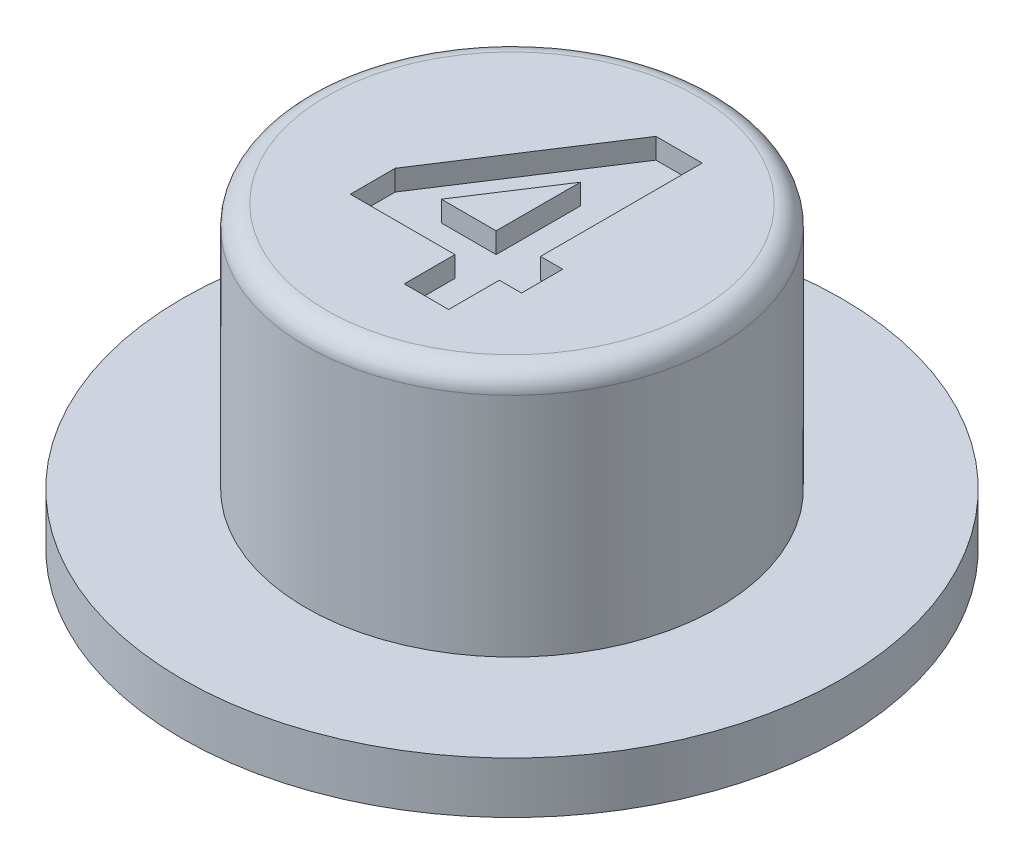
ISO-10303-21;
HEADER;
FILE_DESCRIPTION(('STEP AP214'),'2;1');
FILE_NAME('part.step','',(''),(''),'','','');
FILE_SCHEMA(('AUTOMOTIVE_DESIGN { 1 0 10303 214 1 1 1 1 }'));
ENDSEC;
DATA;
#1=APPLICATION_CONTEXT('core data for automotive mechanical design processes');
#2=APPLICATION_PROTOCOL_DEFINITION('international standard','automotive_design',2000,#1);
#3=PRODUCT_CONTEXT('',#1,'mechanical');
#4=PRODUCT('Part','Part','',(#3));
#5=PRODUCT_RELATED_PRODUCT_CATEGORY('part','',(#4));
#6=PRODUCT_DEFINITION_FORMATION('','',#4);
#7=PRODUCT_DEFINITION_CONTEXT('part definition',#1,'design');
#8=PRODUCT_DEFINITION('design','',#6,#7);
#9=PRODUCT_DEFINITION_SHAPE('','',#8);
#10=(LENGTH_UNIT() NAMED_UNIT(*) SI_UNIT(.MILLI.,.METRE.));
#11=(NAMED_UNIT(*) PLANE_ANGLE_UNIT() SI_UNIT($,.RADIAN.));
#12=(NAMED_UNIT(*) SI_UNIT($,.STERADIAN.) SOLID_ANGLE_UNIT());
#13=UNCERTAINTY_MEASURE_WITH_UNIT(LENGTH_MEASURE(1.E-05),#10,'distance_accuracy_value','');
#14=(GEOMETRIC_REPRESENTATION_CONTEXT(3) GLOBAL_UNCERTAINTY_ASSIGNED_CONTEXT((#13)) GLOBAL_UNIT_ASSIGNED_CONTEXT((#10,
#11,#12)) REPRESENTATION_CONTEXT('',''));
#15=CARTESIAN_POINT('',(0.,0.,0.));
#16=DIRECTION('',(0.,0.,1.));
#17=DIRECTION('',(1.,0.,0.));
#18=AXIS2_PLACEMENT_3D('',#15,#16,#17);
#19=CARTESIAN_POINT('',(0.,7.24999999999999,0.));
#20=DIRECTION('',(0.,-1.,0.));
#21=DIRECTION('',(1.,0.,0.));
#22=AXIS2_PLACEMENT_3D('',#19,#20,#21);
#23=PLANE('',#22);
#24=CARTESIAN_POINT('',(0.,7.24999999999999,0.));
#25=DIRECTION('',(0.,-1.,0.));
#26=DIRECTION('',(1.,0.,0.));
#27=AXIS2_PLACEMENT_3D('',#24,#25,#26);
#28=CIRCLE('',#27,4.49999999999999);
#29=CARTESIAN_POINT('',(4.49999999999999,7.25,0.));
#30=VERTEX_POINT('',#29);
#31=EDGE_CURVE('E41',#30,#30,#28,.F.);
#32=ORIENTED_EDGE('',*,*,#31,.T.);
#33=EDGE_LOOP('',(#32));
#34=FACE_BOUND('',#33,.T.);
#35=DIRECTION('',(0.545200849923092,0.,-0.838305453425622));
#36=VECTOR('',#35,1.);
#37=CARTESIAN_POINT('',(-2.15384615384617,7.24999999999999,0.679086538461539));
#38=LINE('',#37,#36);
#39=CARTESIAN_POINT('',(-2.15384615384617,7.24999999999999,0.679086538461539));
#40=VERTEX_POINT('',#39);
#41=CARTESIAN_POINT('',(0.338942307692288,7.24999999999999,-3.15384615384615));
#42=VERTEX_POINT('',#41);
#43=EDGE_CURVE('E48',#40,#42,#38,.T.);
#44=ORIENTED_EDGE('',*,*,#43,.T.);
#45=DIRECTION('',(1.,0.,0.));
#46=VECTOR('',#45,1.);
#47=CARTESIAN_POINT('',(0.338942307692288,7.24999999999999,-3.15384615384615));
#48=LINE('',#47,#46);
#49=CARTESIAN_POINT('',(1.46153846153844,7.25,-3.15384615384615));
#50=VERTEX_POINT('',#49);
#51=EDGE_CURVE('E218',#42,#50,#48,.T.);
#52=ORIENTED_EDGE('',*,*,#51,.T.);
#53=DIRECTION('',(0.,0.,1.));
#54=VECTOR('',#53,1.);
#55=CARTESIAN_POINT('',(1.46153846153844,7.25,-3.15384615384615));
#56=LINE('',#55,#54);
#57=CARTESIAN_POINT('',(1.46153846153844,7.25,0.769230769230769));
#58=VERTEX_POINT('',#57);
#59=EDGE_CURVE('E221',#50,#58,#56,.T.);
#60=ORIENTED_EDGE('',*,*,#59,.T.);
#61=DIRECTION('',(1.,0.,0.));
#62=VECTOR('',#61,1.);
#63=CARTESIAN_POINT('',(1.46153846153844,7.25,0.769230769230769));
#64=LINE('',#63,#62);
#65=CARTESIAN_POINT('',(1.99999999999998,7.25,0.769230769230769));
#66=VERTEX_POINT('',#65);
#67=EDGE_CURVE('E224',#58,#66,#64,.T.);
#68=ORIENTED_EDGE('',*,*,#67,.T.);
#69=DIRECTION('',(0.,0.,1.));
#70=VECTOR('',#69,1.);
#71=CARTESIAN_POINT('',(1.99999999999998,7.25,0.769230769230769));
#72=LINE('',#71,#70);
#73=CARTESIAN_POINT('',(1.99999999999998,7.25,1.76923076923077));
#74=VERTEX_POINT('',#73);
#75=EDGE_CURVE('E227',#66,#74,#72,.T.);
#76=ORIENTED_EDGE('',*,*,#75,.T.);
#77=DIRECTION('',(-1.,0.,0.));
#78=VECTOR('',#77,1.);
#79=CARTESIAN_POINT('',(1.99999999999998,7.25,1.76923076923077));
#80=LINE('',#79,#78);
#81=CARTESIAN_POINT('',(1.46153846153844,7.25,1.76923076923077));
#82=VERTEX_POINT('',#81);
#83=EDGE_CURVE('E230',#74,#82,#80,.T.);
#84=ORIENTED_EDGE('',*,*,#83,.T.);
#85=DIRECTION('',(0.,0.,1.));
#86=VECTOR('',#85,1.);
#87=CARTESIAN_POINT('',(1.46153846153844,7.25,1.76923076923077));
#88=LINE('',#87,#86);
#89=CARTESIAN_POINT('',(1.46153846153844,7.25,3.));
#90=VERTEX_POINT('',#89);
#91=EDGE_CURVE('E233',#82,#90,#88,.T.);
#92=ORIENTED_EDGE('',*,*,#91,.T.);
#93=DIRECTION('',(-1.,0.,0.));
#94=VECTOR('',#93,1.);
#95=CARTESIAN_POINT('',(1.46153846153844,7.25,3.));
#96=LINE('',#95,#94);
#97=CARTESIAN_POINT('',(0.384615384615365,7.24999999999999,3.));
#98=VERTEX_POINT('',#97);
#99=EDGE_CURVE('E236',#90,#98,#96,.T.);
#100=ORIENTED_EDGE('',*,*,#99,.T.);
#101=DIRECTION('',(0.,0.,-1.));
#102=VECTOR('',#101,1.);
#103=CARTESIAN_POINT('',(0.384615384615365,7.24999999999999,3.));
#104=LINE('',#103,#102);
#105=CARTESIAN_POINT('',(0.384615384615365,7.24999999999999,1.76923076923077));
#106=VERTEX_POINT('',#105);
#107=EDGE_CURVE('E239',#98,#106,#104,.T.);
#108=ORIENTED_EDGE('',*,*,#107,.T.);
#109=DIRECTION('',(-1.,0.,0.));
#110=VECTOR('',#109,1.);
#111=CARTESIAN_POINT('',(0.384615384615365,7.24999999999999,1.76923076923077));
#112=LINE('',#111,#110);
#113=CARTESIAN_POINT('',(-2.15384615384617,7.24999999999999,1.76923076923077));
#114=VERTEX_POINT('',#113);
#115=EDGE_CURVE('E242',#106,#114,#112,.T.);
#116=ORIENTED_EDGE('',*,*,#115,.T.);
#117=DIRECTION('',(0.,0.,-1.));
#118=VECTOR('',#117,1.);
#119=CARTESIAN_POINT('',(-2.15384615384617,7.24999999999999,1.76923076923077));
#120=LINE('',#119,#118);
#121=EDGE_CURVE('E196',#114,#40,#120,.T.);
#122=ORIENTED_EDGE('',*,*,#121,.T.);
#123=EDGE_LOOP('',(#44,#52,#60,#68,#76,#84,#92,#100,#108,#116,#122));
#124=FACE_BOUND('',#123,.T.);
#125=ADVANCED_FACE('F33',(#34,#124),#23,.F.);
#126=CARTESIAN_POINT('',(0.,0.,0.));
#127=DIRECTION('',(0.,1.,0.));
#128=DIRECTION('',(-1.,0.,0.));
#129=AXIS2_PLACEMENT_3D('',#126,#127,#128);
#130=PLANE('',#129);
#131=CARTESIAN_POINT('',(0.,0.,0.));
#132=DIRECTION('',(0.,1.,0.));
#133=DIRECTION('',(-1.,0.,0.));
#134=AXIS2_PLACEMENT_3D('',#131,#132,#133);
#135=CIRCLE('',#134,7.99999999999998);
#136=CARTESIAN_POINT('',(-7.99999999999996,0.,0.));
#137=VERTEX_POINT('',#136);
#138=EDGE_CURVE('E307',#137,#137,#135,.T.);
#139=ORIENTED_EDGE('',*,*,#138,.F.);
#140=EDGE_LOOP('',(#139));
#141=FACE_BOUND('',#140,.T.);
#142=DIRECTION('',(0.,0.,1.));
#143=VECTOR('',#142,1.);
#144=CARTESIAN_POINT('',(-1.25,0.,-1.75));
#145=LINE('',#144,#143);
#146=CARTESIAN_POINT('',(-1.25,0.,-1.75));
#147=VERTEX_POINT('',#146);
#148=CARTESIAN_POINT('',(-1.25,0.,1.75));
#149=VERTEX_POINT('',#148);
#150=EDGE_CURVE('E268',#147,#149,#145,.T.);
#151=ORIENTED_EDGE('',*,*,#150,.T.);
#152=DIRECTION('',(1.,0.,0.));
#153=VECTOR('',#152,1.);
#154=CARTESIAN_POINT('',(-1.25,0.,1.75));
#155=LINE('',#154,#153);
#156=CARTESIAN_POINT('',(1.25,0.,1.75));
#157=VERTEX_POINT('',#156);
#158=EDGE_CURVE('E284',#149,#157,#155,.T.);
#159=ORIENTED_EDGE('',*,*,#158,.T.);
#160=DIRECTION('',(0.,0.,1.));
#161=VECTOR('',#160,1.);
#162=CARTESIAN_POINT('',(1.25,0.,-1.75));
#163=LINE('',#162,#161);
#164=CARTESIAN_POINT('',(1.25,0.,-1.75));
#165=VERTEX_POINT('',#164);
#166=EDGE_CURVE('E287',#165,#157,#163,.T.);
#167=ORIENTED_EDGE('',*,*,#166,.F.);
#168=DIRECTION('',(1.,0.,0.));
#169=VECTOR('',#168,1.);
#170=CARTESIAN_POINT('',(-1.25,0.,-1.75));
#171=LINE('',#170,#169);
#172=EDGE_CURVE('E273',#147,#165,#171,.T.);
#173=ORIENTED_EDGE('',*,*,#172,.F.);
#174=EDGE_LOOP('',(#151,#159,#167,#173));
#175=FACE_BOUND('',#174,.T.);
#176=ADVANCED_FACE('F329',(#141,#175),#130,.F.);
#177=CARTESIAN_POINT('',(0.,7.25,0.));
#178=DIRECTION('',(0.,1.,0.));
#179=DIRECTION('',(-1.,0.,0.));
#180=AXIS2_PLACEMENT_3D('',#177,#178,#179);
#181=CYLINDRICAL_SURFACE('',#180,7.99999999999998);
#182=CARTESIAN_POINT('',(0.,1.24999999999998,0.));
#183=DIRECTION('',(0.,1.,0.));
#184=DIRECTION('',(-1.,0.,0.));
#185=AXIS2_PLACEMENT_3D('',#182,#183,#184);
#186=CIRCLE('',#185,7.99999999999998);
#187=CARTESIAN_POINT('',(-7.99999999999997,1.24999999999996,0.));
#188=VERTEX_POINT('',#187);
#189=EDGE_CURVE('E304',#188,#188,#186,.T.);
#190=ORIENTED_EDGE('',*,*,#189,.F.);
#191=EDGE_LOOP('',(#190));
#192=FACE_BOUND('',#191,.T.);
#193=ORIENTED_EDGE('',*,*,#138,.T.);
#194=EDGE_LOOP('',(#193));
#195=FACE_BOUND('',#194,.T.);
#196=ADVANCED_FACE('F335',(#192,#195),#181,.T.);
#197=CARTESIAN_POINT('',(5.,1.25,0.));
#198=DIRECTION('',(0.,-1.,0.));
#199=DIRECTION('',(1.,0.,0.));
#200=AXIS2_PLACEMENT_3D('',#197,#198,#199);
#201=PLANE('',#200);
#202=CARTESIAN_POINT('',(0.,1.24999999999999,0.));
#203=DIRECTION('',(0.,1.,0.));
#204=DIRECTION('',(-1.,0.,0.));
#205=AXIS2_PLACEMENT_3D('',#202,#203,#204);
#206=CIRCLE('',#205,4.99999999999998);
#207=CARTESIAN_POINT('',(-4.99999999999997,1.24999999999997,0.));
#208=VERTEX_POINT('',#207);
#209=EDGE_CURVE('E301',#208,#208,#206,.T.);
#210=ORIENTED_EDGE('',*,*,#209,.F.);
#211=EDGE_LOOP('',(#210));
#212=FACE_BOUND('',#211,.T.);
#213=ORIENTED_EDGE('',*,*,#189,.T.);
#214=EDGE_LOOP('',(#213));
#215=FACE_BOUND('',#214,.T.);
#216=ADVANCED_FACE('F411',(#212,#215),#201,.F.);
#217=CARTESIAN_POINT('',(0.,7.25,0.));
#218=DIRECTION('',(0.,1.,0.));
#219=DIRECTION('',(-1.,0.,0.));
#220=AXIS2_PLACEMENT_3D('',#217,#218,#219);
#221=CYLINDRICAL_SURFACE('',#220,4.99999999999999);
#222=CARTESIAN_POINT('',(0.,6.74999999999999,0.));
#223=DIRECTION('',(0.,-1.,0.));
#224=DIRECTION('',(1.,0.,0.));
#225=AXIS2_PLACEMENT_3D('',#222,#223,#224);
#226=CIRCLE('',#225,4.99999999999999);
#227=CARTESIAN_POINT('',(4.99999999999999,6.75000000000001,0.));
#228=VERTEX_POINT('',#227);
#229=EDGE_CURVE('E11',#228,#228,#226,.T.);
#230=ORIENTED_EDGE('',*,*,#229,.T.);
#231=EDGE_LOOP('',(#230));
#232=FACE_BOUND('',#231,.T.);
#233=ORIENTED_EDGE('',*,*,#209,.T.);
#234=EDGE_LOOP('',(#233));
#235=FACE_BOUND('',#234,.T.);
#236=ADVANCED_FACE('F406',(#232,#235),#221,.T.);
#237=CARTESIAN_POINT('',(-1.25,3.5,-1.75));
#238=DIRECTION('',(1.,0.,0.));
#239=DIRECTION('',(0.,1.,0.));
#240=AXIS2_PLACEMENT_3D('',#237,#238,#239);
#241=PLANE('',#240);
#242=ORIENTED_EDGE('',*,*,#150,.F.);
#243=DIRECTION('',(0.,-1.,0.));
#244=VECTOR('',#243,1.);
#245=CARTESIAN_POINT('',(-1.25,3.5,-1.75));
#246=LINE('',#245,#244);
#247=CARTESIAN_POINT('',(-1.25,3.5,-1.75));
#248=VERTEX_POINT('',#247);
#249=EDGE_CURVE('E281',#248,#147,#246,.T.);
#250=ORIENTED_EDGE('',*,*,#249,.F.);
#251=DIRECTION('',(0.,0.,1.));
#252=VECTOR('',#251,1.);
#253=CARTESIAN_POINT('',(-1.25,3.5,-1.75));
#254=LINE('',#253,#252);
#255=CARTESIAN_POINT('',(-1.25,3.5,1.75));
#256=VERTEX_POINT('',#255);
#257=EDGE_CURVE('E269',#248,#256,#254,.T.);
#258=ORIENTED_EDGE('',*,*,#257,.T.);
#259=DIRECTION('',(0.,-1.,0.));
#260=VECTOR('',#259,1.);
#261=CARTESIAN_POINT('',(-1.25,3.5,1.75));
#262=LINE('',#261,#260);
#263=EDGE_CURVE('E298',#256,#149,#262,.T.);
#264=ORIENTED_EDGE('',*,*,#263,.T.);
#265=EDGE_LOOP('',(#242,#250,#258,#264));
#266=FACE_BOUND('',#265,.T.);
#267=ADVANCED_FACE('F403',(#266),#241,.T.);
#268=CARTESIAN_POINT('',(-1.25,3.5,1.75));
#269=DIRECTION('',(0.,0.,-1.));
#270=DIRECTION('',(-1.,0.,0.));
#271=AXIS2_PLACEMENT_3D('',#268,#269,#270);
#272=PLANE('',#271);
#273=ORIENTED_EDGE('',*,*,#158,.F.);
#274=ORIENTED_EDGE('',*,*,#263,.F.);
#275=DIRECTION('',(1.,0.,0.));
#276=VECTOR('',#275,1.);
#277=CARTESIAN_POINT('',(-1.25,3.5,1.75));
#278=LINE('',#277,#276);
#279=CARTESIAN_POINT('',(1.25,3.5,1.75));
#280=VERTEX_POINT('',#279);
#281=EDGE_CURVE('E272',#256,#280,#278,.T.);
#282=ORIENTED_EDGE('',*,*,#281,.T.);
#283=DIRECTION('',(0.,-1.,0.));
#284=VECTOR('',#283,1.);
#285=CARTESIAN_POINT('',(1.25,3.5,1.75));
#286=LINE('',#285,#284);
#287=EDGE_CURVE('E296',#280,#157,#286,.T.);
#288=ORIENTED_EDGE('',*,*,#287,.T.);
#289=EDGE_LOOP('',(#273,#274,#282,#288));
#290=FACE_BOUND('',#289,.T.);
#291=ADVANCED_FACE('F400',(#290),#272,.T.);
#292=CARTESIAN_POINT('',(1.25,3.5,-1.75));
#293=DIRECTION('',(1.,0.,0.));
#294=DIRECTION('',(0.,1.,0.));
#295=AXIS2_PLACEMENT_3D('',#292,#293,#294);
#296=PLANE('',#295);
#297=ORIENTED_EDGE('',*,*,#166,.T.);
#298=ORIENTED_EDGE('',*,*,#287,.F.);
#299=DIRECTION('',(0.,0.,1.));
#300=VECTOR('',#299,1.);
#301=CARTESIAN_POINT('',(1.25,3.5,-1.75));
#302=LINE('',#301,#300);
#303=CARTESIAN_POINT('',(1.25,3.5,-1.75));
#304=VERTEX_POINT('',#303);
#305=EDGE_CURVE('E275',#304,#280,#302,.T.);
#306=ORIENTED_EDGE('',*,*,#305,.F.);
#307=DIRECTION('',(0.,-1.,0.));
#308=VECTOR('',#307,1.);
#309=CARTESIAN_POINT('',(1.25,3.5,-1.75));
#310=LINE('',#309,#308);
#311=EDGE_CURVE('E294',#304,#165,#310,.T.);
#312=ORIENTED_EDGE('',*,*,#311,.T.);
#313=EDGE_LOOP('',(#297,#298,#306,#312));
#314=FACE_BOUND('',#313,.T.);
#315=ADVANCED_FACE('F396',(#314),#296,.F.);
#316=CARTESIAN_POINT('',(-1.25,3.5,-1.75));
#317=DIRECTION('',(0.,0.,-1.));
#318=DIRECTION('',(-1.,0.,0.));
#319=AXIS2_PLACEMENT_3D('',#316,#317,#318);
#320=PLANE('',#319);
#321=ORIENTED_EDGE('',*,*,#172,.T.);
#322=ORIENTED_EDGE('',*,*,#311,.F.);
#323=DIRECTION('',(1.,0.,0.));
#324=VECTOR('',#323,1.);
#325=CARTESIAN_POINT('',(-1.25,3.5,-1.75));
#326=LINE('',#325,#324);
#327=EDGE_CURVE('E278',#248,#304,#326,.T.);
#328=ORIENTED_EDGE('',*,*,#327,.F.);
#329=ORIENTED_EDGE('',*,*,#249,.T.);
#330=EDGE_LOOP('',(#321,#322,#328,#329));
#331=FACE_BOUND('',#330,.T.);
#332=ADVANCED_FACE('F324',(#331),#320,.F.);
#333=CARTESIAN_POINT('',(0.,3.5,0.));
#334=DIRECTION('',(0.,1.,0.));
#335=DIRECTION('',(-1.,0.,0.));
#336=AXIS2_PLACEMENT_3D('',#333,#334,#335);
#337=PLANE('',#336);
#338=ORIENTED_EDGE('',*,*,#257,.F.);
#339=ORIENTED_EDGE('',*,*,#327,.T.);
#340=ORIENTED_EDGE('',*,*,#305,.T.);
#341=ORIENTED_EDGE('',*,*,#281,.F.);
#342=EDGE_LOOP('',(#338,#339,#340,#341));
#343=FACE_BOUND('',#342,.T.);
#344=ADVANCED_FACE('F316',(#343),#337,.F.);
#345=CARTESIAN_POINT('',(0.,6.74999999999999,0.));
#346=DIRECTION('',(0.,-1.,0.));
#347=DIRECTION('',(1.,0.,0.));
#348=AXIS2_PLACEMENT_3D('',#345,#346,#347);
#349=TOROIDAL_SURFACE('',#348,4.49999999999999,0.5);
#350=ORIENTED_EDGE('',*,*,#229,.F.);
#351=EDGE_LOOP('',(#350));
#352=FACE_BOUND('',#351,.T.);
#353=ORIENTED_EDGE('',*,*,#31,.F.);
#354=EDGE_LOOP('',(#353));
#355=FACE_BOUND('',#354,.T.);
#356=ADVANCED_FACE('F35',(#352,#355),#349,.T.);
#357=CARTESIAN_POINT('',(-2.15384615384617,6.74999999999999,0.679086538461539));
#358=DIRECTION('',(0.838305453425622,0.,0.545200849923092));
#359=DIRECTION('',(0.545200849923092,0.,-0.838305453425622));
#360=AXIS2_PLACEMENT_3D('',#357,#358,#359);
#361=PLANE('',#360);
#362=ORIENTED_EDGE('',*,*,#43,.F.);
#363=DIRECTION('',(0.,1.,0.));
#364=VECTOR('',#363,1.);
#365=CARTESIAN_POINT('',(-2.15384615384617,6.74999999999999,0.679086538461539));
#366=LINE('',#365,#364);
#367=CARTESIAN_POINT('',(-2.15384615384617,6.74999999999999,0.679086538461539));
#368=VERTEX_POINT('',#367);
#369=EDGE_CURVE('E216',#368,#40,#366,.T.);
#370=ORIENTED_EDGE('',*,*,#369,.F.);
#371=DIRECTION('',(0.545200849923092,0.,-0.838305453425622));
#372=VECTOR('',#371,1.);
#373=CARTESIAN_POINT('',(-2.15384615384617,6.74999999999999,0.679086538461539));
#374=LINE('',#373,#372);
#375=CARTESIAN_POINT('',(0.338942307692289,6.74999999999999,-3.15384615384615));
#376=VERTEX_POINT('',#375);
#377=EDGE_CURVE('E192',#368,#376,#374,.T.);
#378=ORIENTED_EDGE('',*,*,#377,.T.);
#379=DIRECTION('',(0.,1.,0.));
#380=VECTOR('',#379,1.);
#381=CARTESIAN_POINT('',(0.338942307692289,6.74999999999999,-3.15384615384615));
#382=LINE('',#381,#380);
#383=EDGE_CURVE('E266',#376,#42,#382,.T.);
#384=ORIENTED_EDGE('',*,*,#383,.T.);
#385=EDGE_LOOP('',(#362,#370,#378,#384));
#386=FACE_BOUND('',#385,.T.);
#387=ADVANCED_FACE('F315',(#386),#361,.T.);
#388=CARTESIAN_POINT('',(0.338942307692289,6.74999999999999,-3.15384615384615));
#389=DIRECTION('',(0.,0.,1.));
#390=DIRECTION('',(1.,0.,0.));
#391=AXIS2_PLACEMENT_3D('',#388,#389,#390);
#392=PLANE('',#391);
#393=ORIENTED_EDGE('',*,*,#51,.F.);
#394=ORIENTED_EDGE('',*,*,#383,.F.);
#395=DIRECTION('',(1.,0.,0.));
#396=VECTOR('',#395,1.);
#397=CARTESIAN_POINT('',(0.338942307692289,6.74999999999999,-3.15384615384615));
#398=LINE('',#397,#396);
#399=CARTESIAN_POINT('',(1.46153846153844,6.75,-3.15384615384615));
#400=VERTEX_POINT('',#399);
#401=EDGE_CURVE('E195',#376,#400,#398,.T.);
#402=ORIENTED_EDGE('',*,*,#401,.T.);
#403=DIRECTION('',(0.,1.,0.));
#404=VECTOR('',#403,1.);
#405=CARTESIAN_POINT('',(1.46153846153844,6.75,-3.15384615384615));
#406=LINE('',#405,#404);
#407=EDGE_CURVE('E264',#400,#50,#406,.T.);
#408=ORIENTED_EDGE('',*,*,#407,.T.);
#409=EDGE_LOOP('',(#393,#394,#402,#408));
#410=FACE_BOUND('',#409,.T.);
#411=ADVANCED_FACE('F322',(#410),#392,.T.);
#412=CARTESIAN_POINT('',(1.46153846153844,6.75,-3.15384615384615));
#413=DIRECTION('',(-1.,0.,0.));
#414=DIRECTION('',(0.,-1.,0.));
#415=AXIS2_PLACEMENT_3D('',#412,#413,#414);
#416=PLANE('',#415);
#417=ORIENTED_EDGE('',*,*,#59,.F.);
#418=ORIENTED_EDGE('',*,*,#407,.F.);
#419=DIRECTION('',(0.,0.,1.));
#420=VECTOR('',#419,1.);
#421=CARTESIAN_POINT('',(1.46153846153844,6.75,-3.15384615384615));
#422=LINE('',#421,#420);
#423=CARTESIAN_POINT('',(1.46153846153844,6.75,0.769230769230769));
#424=VERTEX_POINT('',#423);
#425=EDGE_CURVE('E198',#400,#424,#422,.T.);
#426=ORIENTED_EDGE('',*,*,#425,.T.);
#427=DIRECTION('',(0.,1.,0.));
#428=VECTOR('',#427,1.);
#429=CARTESIAN_POINT('',(1.46153846153844,6.75,0.769230769230769));
#430=LINE('',#429,#428);
#431=EDGE_CURVE('E262',#424,#58,#430,.T.);
#432=ORIENTED_EDGE('',*,*,#431,.T.);
#433=EDGE_LOOP('',(#417,#418,#426,#432));
#434=FACE_BOUND('',#433,.T.);
#435=ADVANCED_FACE('F386',(#434),#416,.T.);
#436=CARTESIAN_POINT('',(1.46153846153844,6.75,0.769230769230769));
#437=DIRECTION('',(0.,0.,1.));
#438=DIRECTION('',(1.,0.,0.));
#439=AXIS2_PLACEMENT_3D('',#436,#437,#438);
#440=PLANE('',#439);
#441=ORIENTED_EDGE('',*,*,#67,.F.);
#442=ORIENTED_EDGE('',*,*,#431,.F.);
#443=DIRECTION('',(1.,0.,0.));
#444=VECTOR('',#443,1.);
#445=CARTESIAN_POINT('',(1.46153846153844,6.75,0.769230769230769));
#446=LINE('',#445,#444);
#447=CARTESIAN_POINT('',(1.99999999999998,6.75,0.769230769230769));
#448=VERTEX_POINT('',#447);
#449=EDGE_CURVE('E200',#424,#448,#446,.T.);
#450=ORIENTED_EDGE('',*,*,#449,.T.);
#451=DIRECTION('',(0.,1.,0.));
#452=VECTOR('',#451,1.);
#453=CARTESIAN_POINT('',(1.99999999999998,6.75,0.769230769230769));
#454=LINE('',#453,#452);
#455=EDGE_CURVE('E260',#448,#66,#454,.T.);
#456=ORIENTED_EDGE('',*,*,#455,.T.);
#457=EDGE_LOOP('',(#441,#442,#450,#456));
#458=FACE_BOUND('',#457,.T.);
#459=ADVANCED_FACE('F382',(#458),#440,.T.);
#460=CARTESIAN_POINT('',(1.99999999999998,6.75,0.769230769230769));
#461=DIRECTION('',(-1.,0.,0.));
#462=DIRECTION('',(0.,-1.,0.));
#463=AXIS2_PLACEMENT_3D('',#460,#461,#462);
#464=PLANE('',#463);
#465=ORIENTED_EDGE('',*,*,#75,.F.);
#466=ORIENTED_EDGE('',*,*,#455,.F.);
#467=DIRECTION('',(0.,0.,1.));
#468=VECTOR('',#467,1.);
#469=CARTESIAN_POINT('',(1.99999999999998,6.75,0.769230769230769));
#470=LINE('',#469,#468);
#471=CARTESIAN_POINT('',(1.99999999999998,6.75,1.76923076923077));
#472=VERTEX_POINT('',#471);
#473=EDGE_CURVE('E202',#448,#472,#470,.T.);
#474=ORIENTED_EDGE('',*,*,#473,.T.);
#475=DIRECTION('',(0.,1.,0.));
#476=VECTOR('',#475,1.);
#477=CARTESIAN_POINT('',(1.99999999999998,6.75,1.76923076923077));
#478=LINE('',#477,#476);
#479=EDGE_CURVE('E258',#472,#74,#478,.T.);
#480=ORIENTED_EDGE('',*,*,#479,.T.);
#481=EDGE_LOOP('',(#465,#466,#474,#480));
#482=FACE_BOUND('',#481,.T.);
#483=ADVANCED_FACE('F378',(#482),#464,.T.);
#484=CARTESIAN_POINT('',(1.99999999999998,6.75,1.76923076923077));
#485=DIRECTION('',(0.,0.,-1.));
#486=DIRECTION('',(-1.,0.,0.));
#487=AXIS2_PLACEMENT_3D('',#484,#485,#486);
#488=PLANE('',#487);
#489=ORIENTED_EDGE('',*,*,#83,.F.);
#490=ORIENTED_EDGE('',*,*,#479,.F.);
#491=DIRECTION('',(-1.,0.,0.));
#492=VECTOR('',#491,1.);
#493=CARTESIAN_POINT('',(1.99999999999998,6.75,1.76923076923077));
#494=LINE('',#493,#492);
#495=CARTESIAN_POINT('',(1.46153846153844,6.75,1.76923076923077));
#496=VERTEX_POINT('',#495);
#497=EDGE_CURVE('E204',#472,#496,#494,.T.);
#498=ORIENTED_EDGE('',*,*,#497,.T.);
#499=DIRECTION('',(0.,1.,0.));
#500=VECTOR('',#499,1.);
#501=CARTESIAN_POINT('',(1.46153846153844,6.75,1.76923076923077));
#502=LINE('',#501,#500);
#503=EDGE_CURVE('E256',#496,#82,#502,.T.);
#504=ORIENTED_EDGE('',*,*,#503,.T.);
#505=EDGE_LOOP('',(#489,#490,#498,#504));
#506=FACE_BOUND('',#505,.T.);
#507=ADVANCED_FACE('F374',(#506),#488,.T.);
#508=CARTESIAN_POINT('',(1.46153846153844,6.75,1.76923076923077));
#509=DIRECTION('',(-1.,0.,0.));
#510=DIRECTION('',(0.,-1.,0.));
#511=AXIS2_PLACEMENT_3D('',#508,#509,#510);
#512=PLANE('',#511);
#513=ORIENTED_EDGE('',*,*,#91,.F.);
#514=ORIENTED_EDGE('',*,*,#503,.F.);
#515=DIRECTION('',(0.,0.,1.));
#516=VECTOR('',#515,1.);
#517=CARTESIAN_POINT('',(1.46153846153844,6.75,1.76923076923077));
#518=LINE('',#517,#516);
#519=CARTESIAN_POINT('',(1.46153846153844,6.75,3.));
#520=VERTEX_POINT('',#519);
#521=EDGE_CURVE('E206',#496,#520,#518,.T.);
#522=ORIENTED_EDGE('',*,*,#521,.T.);
#523=DIRECTION('',(0.,1.,0.));
#524=VECTOR('',#523,1.);
#525=CARTESIAN_POINT('',(1.46153846153844,6.75,3.));
#526=LINE('',#525,#524);
#527=EDGE_CURVE('E254',#520,#90,#526,.T.);
#528=ORIENTED_EDGE('',*,*,#527,.T.);
#529=EDGE_LOOP('',(#513,#514,#522,#528));
#530=FACE_BOUND('',#529,.T.);
#531=ADVANCED_FACE('F370',(#530),#512,.T.);
#532=CARTESIAN_POINT('',(1.46153846153844,6.75,3.));
#533=DIRECTION('',(0.,0.,-1.));
#534=DIRECTION('',(-1.,0.,0.));
#535=AXIS2_PLACEMENT_3D('',#532,#533,#534);
#536=PLANE('',#535);
#537=ORIENTED_EDGE('',*,*,#99,.F.);
#538=ORIENTED_EDGE('',*,*,#527,.F.);
#539=DIRECTION('',(-1.,0.,0.));
#540=VECTOR('',#539,1.);
#541=CARTESIAN_POINT('',(1.46153846153844,6.75,3.));
#542=LINE('',#541,#540);
#543=CARTESIAN_POINT('',(0.384615384615366,6.74999999999999,3.));
#544=VERTEX_POINT('',#543);
#545=EDGE_CURVE('E208',#520,#544,#542,.T.);
#546=ORIENTED_EDGE('',*,*,#545,.T.);
#547=DIRECTION('',(0.,1.,0.));
#548=VECTOR('',#547,1.);
#549=CARTESIAN_POINT('',(0.384615384615366,6.74999999999999,3.));
#550=LINE('',#549,#548);
#551=EDGE_CURVE('E252',#544,#98,#550,.T.);
#552=ORIENTED_EDGE('',*,*,#551,.T.);
#553=EDGE_LOOP('',(#537,#538,#546,#552));
#554=FACE_BOUND('',#553,.T.);
#555=ADVANCED_FACE('F366',(#554),#536,.T.);
#556=CARTESIAN_POINT('',(0.384615384615366,6.74999999999999,3.));
#557=DIRECTION('',(1.,0.,0.));
#558=DIRECTION('',(0.,1.,0.));
#559=AXIS2_PLACEMENT_3D('',#556,#557,#558);
#560=PLANE('',#559);
#561=ORIENTED_EDGE('',*,*,#107,.F.);
#562=ORIENTED_EDGE('',*,*,#551,.F.);
#563=DIRECTION('',(0.,0.,-1.));
#564=VECTOR('',#563,1.);
#565=CARTESIAN_POINT('',(0.384615384615366,6.74999999999999,3.));
#566=LINE('',#565,#564);
#567=CARTESIAN_POINT('',(0.384615384615366,6.74999999999999,1.76923076923077));
#568=VERTEX_POINT('',#567);
#569=EDGE_CURVE('E210',#544,#568,#566,.T.);
#570=ORIENTED_EDGE('',*,*,#569,.T.);
#571=DIRECTION('',(0.,1.,0.));
#572=VECTOR('',#571,1.);
#573=CARTESIAN_POINT('',(0.384615384615366,6.74999999999999,1.76923076923077));
#574=LINE('',#573,#572);
#575=EDGE_CURVE('E250',#568,#106,#574,.T.);
#576=ORIENTED_EDGE('',*,*,#575,.T.);
#577=EDGE_LOOP('',(#561,#562,#570,#576));
#578=FACE_BOUND('',#577,.T.);
#579=ADVANCED_FACE('F362',(#578),#560,.T.);
#580=CARTESIAN_POINT('',(0.384615384615366,6.74999999999999,1.76923076923077));
#581=DIRECTION('',(0.,0.,-1.));
#582=DIRECTION('',(-1.,0.,0.));
#583=AXIS2_PLACEMENT_3D('',#580,#581,#582);
#584=PLANE('',#583);
#585=ORIENTED_EDGE('',*,*,#115,.F.);
#586=ORIENTED_EDGE('',*,*,#575,.F.);
#587=DIRECTION('',(-1.,0.,0.));
#588=VECTOR('',#587,1.);
#589=CARTESIAN_POINT('',(0.384615384615366,6.74999999999999,1.76923076923077));
#590=LINE('',#589,#588);
#591=CARTESIAN_POINT('',(-2.15384615384617,6.74999999999999,1.76923076923077));
#592=VERTEX_POINT('',#591);
#593=EDGE_CURVE('E212',#568,#592,#590,.T.);
#594=ORIENTED_EDGE('',*,*,#593,.T.);
#595=DIRECTION('',(0.,1.,0.));
#596=VECTOR('',#595,1.);
#597=CARTESIAN_POINT('',(-2.15384615384617,6.74999999999999,1.76923076923077));
#598=LINE('',#597,#596);
#599=EDGE_CURVE('E248',#592,#114,#598,.T.);
#600=ORIENTED_EDGE('',*,*,#599,.T.);
#601=EDGE_LOOP('',(#585,#586,#594,#600));
#602=FACE_BOUND('',#601,.T.);
#603=ADVANCED_FACE('F358',(#602),#584,.T.);
#604=CARTESIAN_POINT('',(-2.15384615384617,6.74999999999999,1.76923076923077));
#605=DIRECTION('',(1.,0.,0.));
#606=DIRECTION('',(0.,1.,0.));
#607=AXIS2_PLACEMENT_3D('',#604,#605,#606);
#608=PLANE('',#607);
#609=ORIENTED_EDGE('',*,*,#121,.F.);
#610=ORIENTED_EDGE('',*,*,#599,.F.);
#611=DIRECTION('',(0.,0.,-1.));
#612=VECTOR('',#611,1.);
#613=CARTESIAN_POINT('',(-2.15384615384617,6.74999999999999,1.76923076923077));
#614=LINE('',#613,#612);
#615=EDGE_CURVE('E214',#592,#368,#614,.T.);
#616=ORIENTED_EDGE('',*,*,#615,.T.);
#617=ORIENTED_EDGE('',*,*,#369,.T.);
#618=EDGE_LOOP('',(#609,#610,#616,#617));
#619=FACE_BOUND('',#618,.T.);
#620=ADVANCED_FACE('F355',(#619),#608,.T.);
#621=CARTESIAN_POINT('',(0.,6.74999999999999,0.));
#622=DIRECTION('',(0.,-1.,0.));
#623=DIRECTION('',(1.,0.,0.));
#624=AXIS2_PLACEMENT_3D('',#621,#622,#623);
#625=PLANE('',#624);
#626=DIRECTION('',(1.,0.,0.));
#627=VECTOR('',#626,1.);
#628=CARTESIAN_POINT('',(-0.943509615384634,6.74999999999999,0.769230769230769));
#629=LINE('',#628,#627);
#630=CARTESIAN_POINT('',(-0.943509615384634,6.74999999999999,0.769230769230769));
#631=VERTEX_POINT('',#630);
#632=CARTESIAN_POINT('',(0.384615384615366,6.74999999999999,0.769230769230769));
#633=VERTEX_POINT('',#632);
#634=EDGE_CURVE('E178',#631,#633,#629,.T.);
#635=ORIENTED_EDGE('',*,*,#634,.F.);
#636=DIRECTION('',(-0.54521378888392,0.,0.838297038293014));
#637=VECTOR('',#636,1.);
#638=CARTESIAN_POINT('',(0.384615384615366,6.74999999999999,-1.27283653846154));
#639=LINE('',#638,#637);
#640=CARTESIAN_POINT('',(0.384615384615366,6.74999999999999,-1.27283653846154));
#641=VERTEX_POINT('',#640);
#642=EDGE_CURVE('E172',#641,#631,#639,.T.);
#643=ORIENTED_EDGE('',*,*,#642,.F.);
#644=DIRECTION('',(0.,0.,-1.));
#645=VECTOR('',#644,1.);
#646=CARTESIAN_POINT('',(0.384615384615366,6.74999999999999,0.769230769230769));
#647=LINE('',#646,#645);
#648=EDGE_CURVE('E164',#633,#641,#647,.T.);
#649=ORIENTED_EDGE('',*,*,#648,.F.);
#650=EDGE_LOOP('',(#635,#643,#649));
#651=FACE_BOUND('',#650,.T.);
#652=ORIENTED_EDGE('',*,*,#377,.F.);
#653=ORIENTED_EDGE('',*,*,#615,.F.);
#654=ORIENTED_EDGE('',*,*,#593,.F.);
#655=ORIENTED_EDGE('',*,*,#569,.F.);
#656=ORIENTED_EDGE('',*,*,#545,.F.);
#657=ORIENTED_EDGE('',*,*,#521,.F.);
#658=ORIENTED_EDGE('',*,*,#497,.F.);
#659=ORIENTED_EDGE('',*,*,#473,.F.);
#660=ORIENTED_EDGE('',*,*,#449,.F.);
#661=ORIENTED_EDGE('',*,*,#425,.F.);
#662=ORIENTED_EDGE('',*,*,#401,.F.);
#663=EDGE_LOOP('',(#652,#653,#654,#655,#656,#657,#658,#659,#660,#661,#662));
#664=FACE_BOUND('',#663,.T.);
#665=ADVANCED_FACE('F176',(#651,#664),#625,.F.);
#666=CARTESIAN_POINT('',(-0.943509615384634,6.74999999999999,0.769230769230769));
#667=DIRECTION('',(0.,0.,1.));
#668=DIRECTION('',(1.,0.,0.));
#669=AXIS2_PLACEMENT_3D('',#666,#667,#668);
#670=PLANE('',#669);
#671=DIRECTION('',(1.,0.,0.));
#672=VECTOR('',#671,1.);
#673=CARTESIAN_POINT('',(-0.943509615384635,7.24999999999999,0.769230769230769));
#674=LINE('',#673,#672);
#675=CARTESIAN_POINT('',(-0.943509615384635,7.24999999999999,0.769230769230769));
#676=VERTEX_POINT('',#675);
#677=CARTESIAN_POINT('',(0.384615384615365,7.24999999999999,0.769230769230769));
#678=VERTEX_POINT('',#677);
#679=EDGE_CURVE('E187',#676,#678,#674,.T.);
#680=ORIENTED_EDGE('',*,*,#679,.F.);
#681=DIRECTION('',(0.,1.,0.));
#682=VECTOR('',#681,1.);
#683=CARTESIAN_POINT('',(-0.943509615384634,6.74999999999999,0.769230769230769));
#684=LINE('',#683,#682);
#685=EDGE_CURVE('E182',#631,#676,#684,.T.);
#686=ORIENTED_EDGE('',*,*,#685,.F.);
#687=ORIENTED_EDGE('',*,*,#634,.T.);
#688=DIRECTION('',(0.,1.,0.));
#689=VECTOR('',#688,1.);
#690=CARTESIAN_POINT('',(0.384615384615366,6.74999999999999,0.769230769230769));
#691=LINE('',#690,#689);
#692=EDGE_CURVE('E161',#633,#678,#691,.T.);
#693=ORIENTED_EDGE('',*,*,#692,.T.);
#694=EDGE_LOOP('',(#680,#686,#687,#693));
#695=FACE_BOUND('',#694,.T.);
#696=ADVANCED_FACE('F181',(#695),#670,.T.);
#697=CARTESIAN_POINT('',(0.384615384615366,6.74999999999999,-1.27283653846154));
#698=DIRECTION('',(-0.838297038293014,0.,-0.54521378888392));
#699=DIRECTION('',(-0.54521378888392,0.,0.838297038293014));
#700=AXIS2_PLACEMENT_3D('',#697,#698,#699);
#701=PLANE('',#700);
#702=DIRECTION('',(-0.54521378888392,0.,0.838297038293014));
#703=VECTOR('',#702,1.);
#704=CARTESIAN_POINT('',(0.384615384615365,7.24999999999999,-1.27283653846154));
#705=LINE('',#704,#703);
#706=CARTESIAN_POINT('',(0.384615384615365,7.24999999999999,-1.27283653846154));
#707=VERTEX_POINT('',#706);
#708=EDGE_CURVE('E56',#707,#676,#705,.T.);
#709=ORIENTED_EDGE('',*,*,#708,.F.);
#710=DIRECTION('',(0.,1.,0.));
#711=VECTOR('',#710,1.);
#712=CARTESIAN_POINT('',(0.384615384615366,6.74999999999999,-1.27283653846154));
#713=LINE('',#712,#711);
#714=EDGE_CURVE('E171',#641,#707,#713,.T.);
#715=ORIENTED_EDGE('',*,*,#714,.F.);
#716=ORIENTED_EDGE('',*,*,#642,.T.);
#717=ORIENTED_EDGE('',*,*,#685,.T.);
#718=EDGE_LOOP('',(#709,#715,#716,#717));
#719=FACE_BOUND('',#718,.T.);
#720=ADVANCED_FACE('F344',(#719),#701,.T.);
#721=CARTESIAN_POINT('',(0.384615384615366,6.74999999999999,0.769230769230769));
#722=DIRECTION('',(1.,0.,0.));
#723=DIRECTION('',(0.,1.,0.));
#724=AXIS2_PLACEMENT_3D('',#721,#722,#723);
#725=PLANE('',#724);
#726=DIRECTION('',(0.,0.,-1.));
#727=VECTOR('',#726,1.);
#728=CARTESIAN_POINT('',(0.384615384615365,7.24999999999999,0.769230769230769));
#729=LINE('',#728,#727);
#730=EDGE_CURVE('E166',#678,#707,#729,.T.);
#731=ORIENTED_EDGE('',*,*,#730,.F.);
#732=ORIENTED_EDGE('',*,*,#692,.F.);
#733=ORIENTED_EDGE('',*,*,#648,.T.);
#734=ORIENTED_EDGE('',*,*,#714,.T.);
#735=EDGE_LOOP('',(#731,#732,#733,#734));
#736=FACE_BOUND('',#735,.T.);
#737=ADVANCED_FACE('F163',(#736),#725,.T.);
#738=ORIENTED_EDGE('',*,*,#679,.T.);
#739=ORIENTED_EDGE('',*,*,#730,.T.);
#740=ORIENTED_EDGE('',*,*,#708,.T.);
#741=EDGE_LOOP('',(#738,#739,#740));
#742=FACE_BOUND('',#741,.T.);
#743=ADVANCED_FACE('F331',(#742),#23,.F.);
#744=CLOSED_SHELL('',(#125,#176,#196,#216,#236,#267,#291,#315,#332,#344,#356,#387,#411,#435,
#459,#483,#507,#531,#555,#579,#603,#620,#665,#696,#720,#737,#743));
#745=MANIFOLD_SOLID_BREP('B2',#744);
#746=ADVANCED_BREP_SHAPE_REPRESENTATION('',(#18,#745),#14);
#747=SHAPE_DEFINITION_REPRESENTATION(#9,#746);
ENDSEC;
END-ISO-10303-21;
